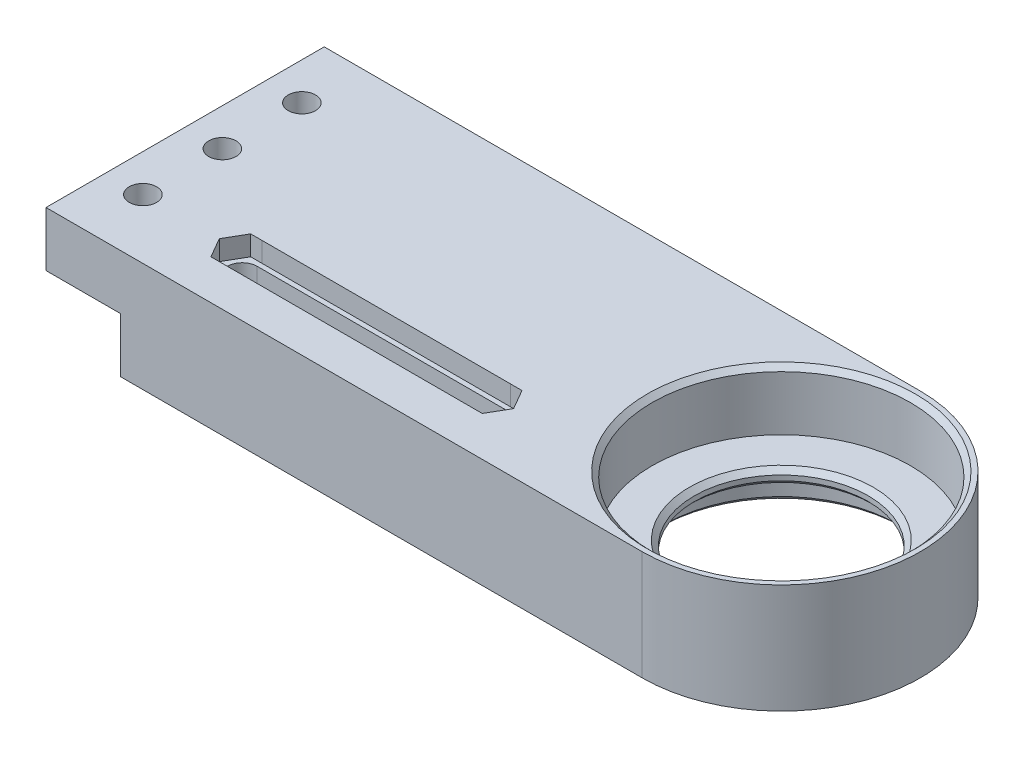
ISO-10303-21;
HEADER;
FILE_DESCRIPTION(('STEP AP214'),'2;1');
FILE_NAME('part.step','',(''),(''),'','','');
FILE_SCHEMA(('AUTOMOTIVE_DESIGN { 1 0 10303 214 1 1 1 1 }'));
ENDSEC;
DATA;
#1=APPLICATION_CONTEXT('core data for automotive mechanical design processes');
#2=APPLICATION_PROTOCOL_DEFINITION('international standard','automotive_design',2000,#1);
#3=PRODUCT_CONTEXT('',#1,'mechanical');
#4=PRODUCT('Part','Part','',(#3));
#5=PRODUCT_RELATED_PRODUCT_CATEGORY('part','',(#4));
#6=PRODUCT_DEFINITION_FORMATION('','',#4);
#7=PRODUCT_DEFINITION_CONTEXT('part definition',#1,'design');
#8=PRODUCT_DEFINITION('design','',#6,#7);
#9=PRODUCT_DEFINITION_SHAPE('','',#8);
#10=(LENGTH_UNIT() NAMED_UNIT(*) SI_UNIT(.MILLI.,.METRE.));
#11=(NAMED_UNIT(*) PLANE_ANGLE_UNIT() SI_UNIT($,.RADIAN.));
#12=(NAMED_UNIT(*) SI_UNIT($,.STERADIAN.) SOLID_ANGLE_UNIT());
#13=UNCERTAINTY_MEASURE_WITH_UNIT(LENGTH_MEASURE(1.E-05),#10,'distance_accuracy_value','');
#14=(GEOMETRIC_REPRESENTATION_CONTEXT(3) GLOBAL_UNCERTAINTY_ASSIGNED_CONTEXT((#13)) GLOBAL_UNIT_ASSIGNED_CONTEXT((#10,
#11,#12)) REPRESENTATION_CONTEXT('',''));
#15=CARTESIAN_POINT('',(0.,0.,0.));
#16=DIRECTION('',(0.,0.,1.));
#17=DIRECTION('',(1.,0.,0.));
#18=AXIS2_PLACEMENT_3D('',#15,#16,#17);
#19=CARTESIAN_POINT('',(0.,22.,0.));
#20=DIRECTION('',(0.,-1.,0.));
#21=DIRECTION('',(0.,0.,-1.));
#22=AXIS2_PLACEMENT_3D('',#19,#20,#21);
#23=PLANE('',#22);
#24=CARTESIAN_POINT('',(-112.5,22.,16.));
#25=DIRECTION('',(0.,1.,0.));
#26=DIRECTION('',(0.,0.,-1.));
#27=AXIS2_PLACEMENT_3D('',#24,#25,#26);
#28=CIRCLE('',#27,2.75000000000001);
#29=CARTESIAN_POINT('',(-112.5,22.,13.25));
#30=VERTEX_POINT('',#29);
#31=EDGE_CURVE('E283',#30,#30,#28,.T.);
#32=ORIENTED_EDGE('',*,*,#31,.F.);
#33=EDGE_LOOP('',(#32));
#34=FACE_BOUND('',#33,.T.);
#35=CARTESIAN_POINT('',(-112.5,22.,-16.));
#36=DIRECTION('',(0.,1.,0.));
#37=DIRECTION('',(0.,0.,1.));
#38=AXIS2_PLACEMENT_3D('',#35,#36,#37);
#39=CIRCLE('',#38,2.75000000000001);
#40=CARTESIAN_POINT('',(-112.5,22.,-13.25));
#41=VERTEX_POINT('',#40);
#42=EDGE_CURVE('E284',#41,#41,#39,.T.);
#43=ORIENTED_EDGE('',*,*,#42,.F.);
#44=EDGE_LOOP('',(#43));
#45=FACE_BOUND('',#44,.T.);
#46=CARTESIAN_POINT('',(-112.5,22.,0.));
#47=DIRECTION('',(0.,1.,0.));
#48=DIRECTION('',(0.,0.,1.));
#49=AXIS2_PLACEMENT_3D('',#46,#47,#48);
#50=CIRCLE('',#49,2.75000000000001);
#51=CARTESIAN_POINT('',(-112.5,22.,2.75000000000001));
#52=VERTEX_POINT('',#51);
#53=EDGE_CURVE('E291',#52,#52,#50,.T.);
#54=ORIENTED_EDGE('',*,*,#53,.F.);
#55=EDGE_LOOP('',(#54));
#56=FACE_BOUND('',#55,.T.);
#57=CARTESIAN_POINT('',(0.,22.,0.));
#58=DIRECTION('',(0.,-1.,0.));
#59=DIRECTION('',(0.,0.,-1.));
#60=AXIS2_PLACEMENT_3D('',#57,#58,#59);
#61=CIRCLE('',#60,27.);
#62=CARTESIAN_POINT('',(0.,22.,-27.));
#63=VERTEX_POINT('',#62);
#64=EDGE_CURVE('E368',#63,#63,#61,.T.);
#65=ORIENTED_EDGE('',*,*,#64,.T.);
#66=EDGE_LOOP('',(#65));
#67=FACE_BOUND('',#66,.T.);
#68=CARTESIAN_POINT('',(0.,22.,0.));
#69=DIRECTION('',(0.,1.,0.));
#70=DIRECTION('',(0.,0.,-1.));
#71=AXIS2_PLACEMENT_3D('',#68,#69,#70);
#72=CIRCLE('',#71,28.);
#73=CARTESIAN_POINT('',(0.,22.,28.));
#74=VERTEX_POINT('',#73);
#75=CARTESIAN_POINT('',(0.,22.,-28.));
#76=VERTEX_POINT('',#75);
#77=EDGE_CURVE('E325',#74,#76,#72,.T.);
#78=ORIENTED_EDGE('',*,*,#77,.T.);
#79=DIRECTION('',(-1.,0.,0.));
#80=VECTOR('',#79,1.);
#81=CARTESIAN_POINT('',(0.,22.,-28.));
#82=LINE('',#81,#80);
#83=CARTESIAN_POINT('',(-120.,22.,-27.9999999999999));
#84=VERTEX_POINT('',#83);
#85=EDGE_CURVE('E328',#76,#84,#82,.T.);
#86=ORIENTED_EDGE('',*,*,#85,.T.);
#87=DIRECTION('',(0.,0.,1.));
#88=VECTOR('',#87,1.);
#89=CARTESIAN_POINT('',(-120.,22.,-27.9999999999999));
#90=LINE('',#89,#88);
#91=CARTESIAN_POINT('',(-120.,22.,28.0000000000001));
#92=VERTEX_POINT('',#91);
#93=EDGE_CURVE('E331',#84,#92,#90,.T.);
#94=ORIENTED_EDGE('',*,*,#93,.T.);
#95=DIRECTION('',(1.,0.,0.));
#96=VECTOR('',#95,1.);
#97=CARTESIAN_POINT('',(0.,22.,28.));
#98=LINE('',#97,#96);
#99=EDGE_CURVE('E333',#92,#74,#98,.T.);
#100=ORIENTED_EDGE('',*,*,#99,.T.);
#101=EDGE_LOOP('',(#78,#86,#94,#100));
#102=FACE_BOUND('',#101,.T.);
#103=DIRECTION('',(-0.499999999999999,0.,0.86602540378444));
#104=VECTOR('',#103,1.);
#105=CARTESIAN_POINT('',(-21.4842503032257,22.,-12.4039376959046));
#106=LINE('',#105,#104);
#107=CARTESIAN_POINT('',(-37.8832713780015,22.,16.));
#108=VERTEX_POINT('',#107);
#109=CARTESIAN_POINT('',(-40.1916363874713,22.,19.998205478816));
#110=VERTEX_POINT('',#109);
#111=EDGE_CURVE('E48',#108,#110,#106,.T.);
#112=ORIENTED_EDGE('',*,*,#111,.T.);
#113=DIRECTION('',(-0.999999697824989,0.,0.000777399466875769));
#114=VECTOR('',#113,1.);
#115=CARTESIAN_POINT('',(0.0155222997672298,22.,19.9669484456429));
#116=LINE('',#115,#114);
#117=CARTESIAN_POINT('',(-42.5,22.,20.));
#118=VERTEX_POINT('',#117);
#119=EDGE_CURVE('E191',#110,#118,#116,.T.);
#120=ORIENTED_EDGE('',*,*,#119,.T.);
#121=DIRECTION('',(1.,0.,0.));
#122=VECTOR('',#121,1.);
#123=CARTESIAN_POINT('',(0.,22.,20.));
#124=LINE('',#123,#122);
#125=CARTESIAN_POINT('',(-92.5,22.,20.));
#126=VERTEX_POINT('',#125);
#127=EDGE_CURVE('E194',#126,#118,#124,.T.);
#128=ORIENTED_EDGE('',*,*,#127,.F.);
#129=DIRECTION('',(0.999999697824989,0.,0.000777399466875764));
#130=VECTOR('',#129,1.);
#131=CARTESIAN_POINT('',(-0.0156038870079281,22.,20.0718973419581));
#132=LINE('',#131,#130);
#133=CARTESIAN_POINT('',(-94.8083636125287,22.,19.998205478816));
#134=VERTEX_POINT('',#133);
#135=EDGE_CURVE('E239',#134,#126,#132,.T.);
#136=ORIENTED_EDGE('',*,*,#135,.F.);
#137=DIRECTION('',(0.499999999999999,0.,0.86602540378444));
#138=VECTOR('',#137,1.);
#139=CARTESIAN_POINT('',(-79.7657496967746,22.,46.0527770595449));
#140=LINE('',#139,#138);
#141=CARTESIAN_POINT('',(-97.1167286219986,22.,16.));
#142=VERTEX_POINT('',#141);
#143=EDGE_CURVE('E236',#142,#134,#140,.T.);
#144=ORIENTED_EDGE('',*,*,#143,.F.);
#145=DIRECTION('',(-0.500000000000002,0.,0.866025403784438));
#146=VECTOR('',#145,1.);
#147=CARTESIAN_POINT('',(-65.9093432362233,22.,-38.0527770595451));
#148=LINE('',#147,#146);
#149=CARTESIAN_POINT('',(-94.8083650094699,22.,12.0017969407571));
#150=VERTEX_POINT('',#149);
#151=EDGE_CURVE('E233',#150,#142,#148,.T.);
#152=ORIENTED_EDGE('',*,*,#151,.F.);
#153=DIRECTION('',(0.999999697009955,0.,-0.000778447171596968));
#154=VECTOR('',#153,1.);
#155=CARTESIAN_POINT('',(0.00928531007891821,22.,11.9279863866845));
#156=LINE('',#155,#154);
#157=CARTESIAN_POINT('',(-92.5,22.,12.));
#158=VERTEX_POINT('',#157);
#159=EDGE_CURVE('E230',#150,#158,#156,.T.);
#160=ORIENTED_EDGE('',*,*,#159,.T.);
#161=DIRECTION('',(1.,0.,0.));
#162=VECTOR('',#161,1.);
#163=CARTESIAN_POINT('',(0.,22.,12.));
#164=LINE('',#163,#162);
#165=CARTESIAN_POINT('',(-42.5,22.,12.));
#166=VERTEX_POINT('',#165);
#167=EDGE_CURVE('E227',#158,#166,#164,.T.);
#168=ORIENTED_EDGE('',*,*,#167,.T.);
#169=DIRECTION('',(-0.999999697009955,0.,-0.000778447171596973));
#170=VECTOR('',#169,1.);
#171=CARTESIAN_POINT('',(-0.00936711737877886,22.,12.0330767230088));
#172=LINE('',#171,#170);
#173=CARTESIAN_POINT('',(-40.1916349905302,22.,12.0017969407571));
#174=VERTEX_POINT('',#173);
#175=EDGE_CURVE('E224',#174,#166,#172,.T.);
#176=ORIENTED_EDGE('',*,*,#175,.F.);
#177=DIRECTION('',(0.500000000000002,0.,0.866025403784438));
#178=VECTOR('',#177,1.);
#179=CARTESIAN_POINT('',(-35.3406567637766,22.,20.4039376959047));
#180=LINE('',#179,#178);
#181=EDGE_CURVE('E222',#174,#108,#180,.T.);
#182=ORIENTED_EDGE('',*,*,#181,.T.);
#183=EDGE_LOOP('',(#112,#120,#128,#136,#144,#152,#160,#168,#176,#182));
#184=FACE_BOUND('',#183,.T.);
#185=ADVANCED_FACE('F33',(#34,#45,#56,#67,#102,#184),#23,.F.);
#186=CARTESIAN_POINT('',(-42.5,-0.001000000000001,16.));
#187=DIRECTION('',(0.,1.,0.));
#188=DIRECTION('',(0.,0.,1.));
#189=AXIS2_PLACEMENT_3D('',#186,#187,#188);
#190=CYLINDRICAL_SURFACE('',#189,3.);
#191=DIRECTION('',(0.,1.,0.));
#192=VECTOR('',#191,1.);
#193=CARTESIAN_POINT('',(-42.5,-0.001000000000001,19.));
#194=LINE('',#193,#192);
#195=CARTESIAN_POINT('',(-42.5,0.,19.));
#196=VERTEX_POINT('',#195);
#197=CARTESIAN_POINT('',(-42.5,18.,19.));
#198=VERTEX_POINT('',#197);
#199=EDGE_CURVE('E269',#196,#198,#194,.T.);
#200=ORIENTED_EDGE('',*,*,#199,.T.);
#201=CARTESIAN_POINT('',(-42.5,18.,16.));
#202=DIRECTION('',(0.,1.,0.));
#203=DIRECTION('',(0.,0.,1.));
#204=AXIS2_PLACEMENT_3D('',#201,#202,#203);
#205=CIRCLE('',#204,3.);
#206=CARTESIAN_POINT('',(-42.5,18.,13.));
#207=VERTEX_POINT('',#206);
#208=EDGE_CURVE('E216',#207,#198,#205,.F.);
#209=ORIENTED_EDGE('',*,*,#208,.F.);
#210=DIRECTION('',(0.,1.,0.));
#211=VECTOR('',#210,1.);
#212=CARTESIAN_POINT('',(-42.5,-0.001000000000001,13.));
#213=LINE('',#212,#211);
#214=CARTESIAN_POINT('',(-42.5,0.,13.));
#215=VERTEX_POINT('',#214);
#216=EDGE_CURVE('E268',#215,#207,#213,.T.);
#217=ORIENTED_EDGE('',*,*,#216,.F.);
#218=CARTESIAN_POINT('',(-42.5,0.,16.));
#219=DIRECTION('',(0.,-1.,0.));
#220=DIRECTION('',(0.,0.,-1.));
#221=AXIS2_PLACEMENT_3D('',#218,#219,#220);
#222=CIRCLE('',#221,3.);
#223=EDGE_CURVE('E266',#215,#196,#222,.T.);
#224=ORIENTED_EDGE('',*,*,#223,.T.);
#225=EDGE_LOOP('',(#200,#209,#217,#224));
#226=FACE_BOUND('',#225,.T.);
#227=ADVANCED_FACE('F391',(#226),#190,.F.);
#228=CARTESIAN_POINT('',(0.,-0.001000000000001,19.));
#229=DIRECTION('',(0.,0.,-1.));
#230=DIRECTION('',(-1.,0.,0.));
#231=AXIS2_PLACEMENT_3D('',#228,#229,#230);
#232=PLANE('',#231);
#233=DIRECTION('',(0.,1.,0.));
#234=VECTOR('',#233,1.);
#235=CARTESIAN_POINT('',(-92.5,-0.001000000000001,19.));
#236=LINE('',#235,#234);
#237=CARTESIAN_POINT('',(-92.5,0.,19.));
#238=VERTEX_POINT('',#237);
#239=CARTESIAN_POINT('',(-92.5,18.,19.));
#240=VERTEX_POINT('',#239);
#241=EDGE_CURVE('E273',#238,#240,#236,.T.);
#242=ORIENTED_EDGE('',*,*,#241,.T.);
#243=DIRECTION('',(-1.,0.,0.));
#244=VECTOR('',#243,1.);
#245=CARTESIAN_POINT('',(0.,18.,19.));
#246=LINE('',#245,#244);
#247=EDGE_CURVE('E218',#198,#240,#246,.T.);
#248=ORIENTED_EDGE('',*,*,#247,.F.);
#249=ORIENTED_EDGE('',*,*,#199,.F.);
#250=DIRECTION('',(-1.,0.,0.));
#251=VECTOR('',#250,1.);
#252=CARTESIAN_POINT('',(0.,0.,19.));
#253=LINE('',#252,#251);
#254=EDGE_CURVE('E264',#196,#238,#253,.T.);
#255=ORIENTED_EDGE('',*,*,#254,.T.);
#256=EDGE_LOOP('',(#242,#248,#249,#255));
#257=FACE_BOUND('',#256,.T.);
#258=ADVANCED_FACE('F397',(#257),#232,.T.);
#259=CARTESIAN_POINT('',(-92.5,-0.001000000000001,16.));
#260=DIRECTION('',(0.,1.,0.));
#261=DIRECTION('',(0.,0.,1.));
#262=AXIS2_PLACEMENT_3D('',#259,#260,#261);
#263=CYLINDRICAL_SURFACE('',#262,3.);
#264=CARTESIAN_POINT('',(-92.5,18.,16.));
#265=DIRECTION('',(0.,1.,0.));
#266=DIRECTION('',(0.,0.,1.));
#267=AXIS2_PLACEMENT_3D('',#264,#265,#266);
#268=CIRCLE('',#267,3.);
#269=CARTESIAN_POINT('',(-92.5,18.,13.));
#270=VERTEX_POINT('',#269);
#271=EDGE_CURVE('E56',#270,#240,#268,.T.);
#272=ORIENTED_EDGE('',*,*,#271,.T.);
#273=ORIENTED_EDGE('',*,*,#241,.F.);
#274=CARTESIAN_POINT('',(-92.5,0.,16.));
#275=DIRECTION('',(0.,-1.,0.));
#276=DIRECTION('',(0.,0.,-1.));
#277=AXIS2_PLACEMENT_3D('',#274,#275,#276);
#278=CIRCLE('',#277,3.);
#279=CARTESIAN_POINT('',(-92.5,0.,13.));
#280=VERTEX_POINT('',#279);
#281=EDGE_CURVE('E246',#280,#238,#278,.F.);
#282=ORIENTED_EDGE('',*,*,#281,.F.);
#283=DIRECTION('',(0.,1.,0.));
#284=VECTOR('',#283,1.);
#285=CARTESIAN_POINT('',(-92.5,-0.001000000000001,13.));
#286=LINE('',#285,#284);
#287=EDGE_CURVE('E276',#280,#270,#286,.T.);
#288=ORIENTED_EDGE('',*,*,#287,.T.);
#289=EDGE_LOOP('',(#272,#273,#282,#288));
#290=FACE_BOUND('',#289,.T.);
#291=ADVANCED_FACE('F546',(#290),#263,.F.);
#292=CARTESIAN_POINT('',(0.,-0.001000000000001,13.));
#293=DIRECTION('',(0.,0.,-1.));
#294=DIRECTION('',(-1.,0.,0.));
#295=AXIS2_PLACEMENT_3D('',#292,#293,#294);
#296=PLANE('',#295);
#297=DIRECTION('',(-1.,0.,0.));
#298=VECTOR('',#297,1.);
#299=CARTESIAN_POINT('',(0.,18.,13.));
#300=LINE('',#299,#298);
#301=EDGE_CURVE('E214',#207,#270,#300,.T.);
#302=ORIENTED_EDGE('',*,*,#301,.T.);
#303=ORIENTED_EDGE('',*,*,#287,.F.);
#304=DIRECTION('',(-1.,0.,0.));
#305=VECTOR('',#304,1.);
#306=CARTESIAN_POINT('',(0.,0.,13.));
#307=LINE('',#306,#305);
#308=EDGE_CURVE('E272',#215,#280,#307,.T.);
#309=ORIENTED_EDGE('',*,*,#308,.F.);
#310=ORIENTED_EDGE('',*,*,#216,.T.);
#311=EDGE_LOOP('',(#302,#303,#309,#310));
#312=FACE_BOUND('',#311,.T.);
#313=ADVANCED_FACE('F410',(#312),#296,.F.);
#314=CARTESIAN_POINT('',(0.,0.,0.));
#315=DIRECTION('',(0.,-1.,0.));
#316=DIRECTION('',(0.,0.,-1.));
#317=AXIS2_PLACEMENT_3D('',#314,#315,#316);
#318=PLANE('',#317);
#319=CARTESIAN_POINT('',(0.,0.,0.));
#320=DIRECTION('',(0.,-1.,0.));
#321=DIRECTION('',(0.,0.,-1.));
#322=AXIS2_PLACEMENT_3D('',#319,#320,#321);
#323=CIRCLE('',#322,24.5);
#324=CARTESIAN_POINT('',(0.,0.,-24.5));
#325=VERTEX_POINT('',#324);
#326=EDGE_CURVE('E11',#325,#325,#323,.F.);
#327=ORIENTED_EDGE('',*,*,#326,.T.);
#328=EDGE_LOOP('',(#327));
#329=FACE_BOUND('',#328,.T.);
#330=DIRECTION('',(0.,0.,1.));
#331=VECTOR('',#330,1.);
#332=CARTESIAN_POINT('',(-105.,0.,-28.001));
#333=LINE('',#332,#331);
#334=CARTESIAN_POINT('',(-105.,0.,-27.9999999999999));
#335=VERTEX_POINT('',#334);
#336=CARTESIAN_POINT('',(-105.,0.,28.));
#337=VERTEX_POINT('',#336);
#338=EDGE_CURVE('E317',#335,#337,#333,.T.);
#339=ORIENTED_EDGE('',*,*,#338,.F.);
#340=DIRECTION('',(-1.,0.,0.));
#341=VECTOR('',#340,1.);
#342=CARTESIAN_POINT('',(0.,0.,-28.));
#343=LINE('',#342,#341);
#344=CARTESIAN_POINT('',(0.,0.,-28.));
#345=VERTEX_POINT('',#344);
#346=EDGE_CURVE('E338',#345,#335,#343,.T.);
#347=ORIENTED_EDGE('',*,*,#346,.F.);
#348=CARTESIAN_POINT('',(0.,0.,0.));
#349=DIRECTION('',(0.,1.,0.));
#350=DIRECTION('',(0.,0.,-1.));
#351=AXIS2_PLACEMENT_3D('',#348,#349,#350);
#352=CIRCLE('',#351,28.);
#353=CARTESIAN_POINT('',(0.,0.,28.));
#354=VERTEX_POINT('',#353);
#355=EDGE_CURVE('E321',#354,#345,#352,.T.);
#356=ORIENTED_EDGE('',*,*,#355,.F.);
#357=DIRECTION('',(1.,0.,0.));
#358=VECTOR('',#357,1.);
#359=CARTESIAN_POINT('',(0.,0.,28.));
#360=LINE('',#359,#358);
#361=EDGE_CURVE('E329',#337,#354,#360,.T.);
#362=ORIENTED_EDGE('',*,*,#361,.F.);
#363=EDGE_LOOP('',(#339,#347,#356,#362));
#364=FACE_BOUND('',#363,.T.);
#365=ORIENTED_EDGE('',*,*,#254,.F.);
#366=ORIENTED_EDGE('',*,*,#223,.F.);
#367=ORIENTED_EDGE('',*,*,#308,.T.);
#368=ORIENTED_EDGE('',*,*,#281,.T.);
#369=EDGE_LOOP('',(#365,#366,#367,#368));
#370=FACE_BOUND('',#369,.T.);
#371=ADVANCED_FACE('F406',(#329,#364,#370),#318,.T.);
#372=CARTESIAN_POINT('',(0.,-0.000999999999999265,0.));
#373=DIRECTION('',(0.,1.,0.));
#374=DIRECTION('',(0.,0.,1.));
#375=AXIS2_PLACEMENT_3D('',#372,#373,#374);
#376=CYLINDRICAL_SURFACE('',#375,17.5);
#377=CARTESIAN_POINT('',(0.,7.99999999999995,0.));
#378=DIRECTION('',(0.,-1.,0.));
#379=DIRECTION('',(0.,0.,-1.));
#380=AXIS2_PLACEMENT_3D('',#377,#378,#379);
#381=CIRCLE('',#380,17.5);
#382=CARTESIAN_POINT('',(0.,7.99999999999995,-17.5));
#383=VERTEX_POINT('',#382);
#384=EDGE_CURVE('E359',#383,#383,#381,.T.);
#385=ORIENTED_EDGE('',*,*,#384,.T.);
#386=EDGE_LOOP('',(#385));
#387=FACE_BOUND('',#386,.T.);
#388=CARTESIAN_POINT('',(0.,9.00000000000002,0.));
#389=DIRECTION('',(0.,1.,0.));
#390=DIRECTION('',(0.,0.,1.));
#391=AXIS2_PLACEMENT_3D('',#388,#389,#390);
#392=CIRCLE('',#391,17.5);
#393=CARTESIAN_POINT('',(0.,9.00000000000002,17.5));
#394=VERTEX_POINT('',#393);
#395=EDGE_CURVE('E356',#394,#394,#392,.T.);
#396=ORIENTED_EDGE('',*,*,#395,.T.);
#397=EDGE_LOOP('',(#396));
#398=FACE_BOUND('',#397,.T.);
#399=ADVANCED_FACE('F409',(#387,#398),#376,.F.);
#400=CARTESIAN_POINT('',(0.,22.,0.));
#401=DIRECTION('',(0.,-1.,0.));
#402=DIRECTION('',(0.,0.,-1.));
#403=AXIS2_PLACEMENT_3D('',#400,#401,#402);
#404=CYLINDRICAL_SURFACE('',#403,28.);
#405=ORIENTED_EDGE('',*,*,#355,.T.);
#406=DIRECTION('',(0.,-1.,0.));
#407=VECTOR('',#406,1.);
#408=CARTESIAN_POINT('',(0.,22.,-28.));
#409=LINE('',#408,#407);
#410=EDGE_CURVE('E350',#76,#345,#409,.T.);
#411=ORIENTED_EDGE('',*,*,#410,.F.);
#412=ORIENTED_EDGE('',*,*,#77,.F.);
#413=DIRECTION('',(0.,-1.,0.));
#414=VECTOR('',#413,1.);
#415=CARTESIAN_POINT('',(0.,22.,28.));
#416=LINE('',#415,#414);
#417=EDGE_CURVE('E335',#74,#354,#416,.T.);
#418=ORIENTED_EDGE('',*,*,#417,.T.);
#419=EDGE_LOOP('',(#405,#411,#412,#418));
#420=FACE_BOUND('',#419,.T.);
#421=ADVANCED_FACE('F424',(#420),#404,.T.);
#422=CARTESIAN_POINT('',(0.,22.,-28.));
#423=DIRECTION('',(0.,0.,1.));
#424=DIRECTION('',(1.,0.,0.));
#425=AXIS2_PLACEMENT_3D('',#422,#423,#424);
#426=PLANE('',#425);
#427=DIRECTION('',(0.,-1.,0.));
#428=VECTOR('',#427,1.);
#429=CARTESIAN_POINT('',(-105.,0.,-27.9999999999999));
#430=LINE('',#429,#428);
#431=CARTESIAN_POINT('',(-105.,11.,-27.9999999999999));
#432=VERTEX_POINT('',#431);
#433=EDGE_CURVE('E307',#432,#335,#430,.T.);
#434=ORIENTED_EDGE('',*,*,#433,.F.);
#435=DIRECTION('',(1.,0.,0.));
#436=VECTOR('',#435,1.);
#437=CARTESIAN_POINT('',(-120.,11.,-27.9999999999999));
#438=LINE('',#437,#436);
#439=CARTESIAN_POINT('',(-120.,11.,-27.9999999999999));
#440=VERTEX_POINT('',#439);
#441=EDGE_CURVE('E309',#440,#432,#438,.T.);
#442=ORIENTED_EDGE('',*,*,#441,.F.);
#443=DIRECTION('',(0.,-1.,0.));
#444=VECTOR('',#443,1.);
#445=CARTESIAN_POINT('',(-120.,22.,-27.9999999999999));
#446=LINE('',#445,#444);
#447=EDGE_CURVE('E347',#84,#440,#446,.T.);
#448=ORIENTED_EDGE('',*,*,#447,.F.);
#449=ORIENTED_EDGE('',*,*,#85,.F.);
#450=ORIENTED_EDGE('',*,*,#410,.T.);
#451=ORIENTED_EDGE('',*,*,#346,.T.);
#452=EDGE_LOOP('',(#434,#442,#448,#449,#450,#451));
#453=FACE_BOUND('',#452,.T.);
#454=ADVANCED_FACE('F420',(#453),#426,.F.);
#455=CARTESIAN_POINT('',(-120.,22.,-27.9999999999999));
#456=DIRECTION('',(1.,0.,0.));
#457=DIRECTION('',(0.,0.,-1.));
#458=AXIS2_PLACEMENT_3D('',#455,#456,#457);
#459=PLANE('',#458);
#460=ORIENTED_EDGE('',*,*,#447,.T.);
#461=DIRECTION('',(0.,0.,1.));
#462=VECTOR('',#461,1.);
#463=CARTESIAN_POINT('',(-120.,11.,-28.001));
#464=LINE('',#463,#462);
#465=CARTESIAN_POINT('',(-120.,11.,28.));
#466=VERTEX_POINT('',#465);
#467=EDGE_CURVE('E318',#440,#466,#464,.T.);
#468=ORIENTED_EDGE('',*,*,#467,.T.);
#469=DIRECTION('',(0.,-1.,0.));
#470=VECTOR('',#469,1.);
#471=CARTESIAN_POINT('',(-120.,22.,28.0000000000001));
#472=LINE('',#471,#470);
#473=EDGE_CURVE('E344',#92,#466,#472,.T.);
#474=ORIENTED_EDGE('',*,*,#473,.F.);
#475=ORIENTED_EDGE('',*,*,#93,.F.);
#476=EDGE_LOOP('',(#460,#468,#474,#475));
#477=FACE_BOUND('',#476,.T.);
#478=ADVANCED_FACE('F416',(#477),#459,.F.);
#479=CARTESIAN_POINT('',(0.,22.,28.));
#480=DIRECTION('',(0.,0.,-1.));
#481=DIRECTION('',(-1.,0.,0.));
#482=AXIS2_PLACEMENT_3D('',#479,#480,#481);
#483=PLANE('',#482);
#484=ORIENTED_EDGE('',*,*,#473,.T.);
#485=DIRECTION('',(-1.,0.,0.));
#486=VECTOR('',#485,1.);
#487=CARTESIAN_POINT('',(-120.,11.,28.));
#488=LINE('',#487,#486);
#489=CARTESIAN_POINT('',(-105.,11.,28.));
#490=VERTEX_POINT('',#489);
#491=EDGE_CURVE('E315',#490,#466,#488,.T.);
#492=ORIENTED_EDGE('',*,*,#491,.F.);
#493=DIRECTION('',(0.,1.,0.));
#494=VECTOR('',#493,1.);
#495=CARTESIAN_POINT('',(-105.,0.,28.));
#496=LINE('',#495,#494);
#497=EDGE_CURVE('E312',#337,#490,#496,.T.);
#498=ORIENTED_EDGE('',*,*,#497,.F.);
#499=ORIENTED_EDGE('',*,*,#361,.T.);
#500=ORIENTED_EDGE('',*,*,#417,.F.);
#501=ORIENTED_EDGE('',*,*,#99,.F.);
#502=EDGE_LOOP('',(#484,#492,#498,#499,#500,#501));
#503=FACE_BOUND('',#502,.T.);
#504=ADVANCED_FACE('F412',(#503),#483,.F.);
#505=CARTESIAN_POINT('',(-120.,11.,-28.001));
#506=DIRECTION('',(0.,1.,0.));
#507=DIRECTION('',(0.,0.,1.));
#508=AXIS2_PLACEMENT_3D('',#505,#506,#507);
#509=PLANE('',#508);
#510=CARTESIAN_POINT('',(-112.5,11.,16.));
#511=DIRECTION('',(0.,1.,0.));
#512=DIRECTION('',(0.,0.,1.));
#513=AXIS2_PLACEMENT_3D('',#510,#511,#512);
#514=CIRCLE('',#513,2.75000000000001);
#515=CARTESIAN_POINT('',(-112.5,11.,18.75));
#516=VERTEX_POINT('',#515);
#517=EDGE_CURVE('E288',#516,#516,#514,.F.);
#518=ORIENTED_EDGE('',*,*,#517,.F.);
#519=EDGE_LOOP('',(#518));
#520=FACE_BOUND('',#519,.T.);
#521=CARTESIAN_POINT('',(-112.5,11.,-16.));
#522=DIRECTION('',(0.,1.,0.));
#523=DIRECTION('',(0.,0.,1.));
#524=AXIS2_PLACEMENT_3D('',#521,#522,#523);
#525=CIRCLE('',#524,2.75000000000001);
#526=CARTESIAN_POINT('',(-112.5,11.,-13.25));
#527=VERTEX_POINT('',#526);
#528=EDGE_CURVE('E287',#527,#527,#525,.F.);
#529=ORIENTED_EDGE('',*,*,#528,.F.);
#530=EDGE_LOOP('',(#529));
#531=FACE_BOUND('',#530,.T.);
#532=CARTESIAN_POINT('',(-112.5,11.,0.));
#533=DIRECTION('',(0.,1.,0.));
#534=DIRECTION('',(0.,0.,1.));
#535=AXIS2_PLACEMENT_3D('',#532,#533,#534);
#536=CIRCLE('',#535,2.75000000000001);
#537=CARTESIAN_POINT('',(-112.5,11.,2.75000000000001));
#538=VERTEX_POINT('',#537);
#539=EDGE_CURVE('E298',#538,#538,#536,.F.);
#540=ORIENTED_EDGE('',*,*,#539,.F.);
#541=EDGE_LOOP('',(#540));
#542=FACE_BOUND('',#541,.T.);
#543=ORIENTED_EDGE('',*,*,#441,.T.);
#544=DIRECTION('',(0.,0.,1.));
#545=VECTOR('',#544,1.);
#546=CARTESIAN_POINT('',(-105.,11.,-28.001));
#547=LINE('',#546,#545);
#548=EDGE_CURVE('E322',#432,#490,#547,.T.);
#549=ORIENTED_EDGE('',*,*,#548,.T.);
#550=ORIENTED_EDGE('',*,*,#491,.T.);
#551=ORIENTED_EDGE('',*,*,#467,.F.);
#552=EDGE_LOOP('',(#543,#549,#550,#551));
#553=FACE_BOUND('',#552,.T.);
#554=ADVANCED_FACE('F415',(#520,#531,#542,#553),#509,.F.);
#555=CARTESIAN_POINT('',(-105.,0.,-28.001));
#556=DIRECTION('',(1.,0.,0.));
#557=DIRECTION('',(0.,0.,-1.));
#558=AXIS2_PLACEMENT_3D('',#555,#556,#557);
#559=PLANE('',#558);
#560=ORIENTED_EDGE('',*,*,#433,.T.);
#561=ORIENTED_EDGE('',*,*,#338,.T.);
#562=ORIENTED_EDGE('',*,*,#497,.T.);
#563=ORIENTED_EDGE('',*,*,#548,.F.);
#564=EDGE_LOOP('',(#560,#561,#562,#563));
#565=FACE_BOUND('',#564,.T.);
#566=ADVANCED_FACE('F404',(#565),#559,.F.);
#567=CARTESIAN_POINT('',(0.,10.,0.));
#568=DIRECTION('',(0.,1.,0.));
#569=DIRECTION('',(0.,0.,1.));
#570=AXIS2_PLACEMENT_3D('',#567,#568,#569);
#571=CYLINDRICAL_SURFACE('',#570,26.);
#572=CARTESIAN_POINT('',(0.,21.,0.));
#573=DIRECTION('',(0.,-1.,0.));
#574=DIRECTION('',(0.,0.,-1.));
#575=AXIS2_PLACEMENT_3D('',#572,#573,#574);
#576=CIRCLE('',#575,26.);
#577=CARTESIAN_POINT('',(0.,21.,-26.));
#578=VERTEX_POINT('',#577);
#579=EDGE_CURVE('E365',#578,#578,#576,.F.);
#580=ORIENTED_EDGE('',*,*,#579,.T.);
#581=EDGE_LOOP('',(#580));
#582=FACE_BOUND('',#581,.T.);
#583=CARTESIAN_POINT('',(0.,10.,0.));
#584=DIRECTION('',(0.,1.,0.));
#585=DIRECTION('',(0.,0.,1.));
#586=AXIS2_PLACEMENT_3D('',#583,#584,#585);
#587=CIRCLE('',#586,26.);
#588=CARTESIAN_POINT('',(0.,10.,26.));
#589=VERTEX_POINT('',#588);
#590=EDGE_CURVE('E304',#589,#589,#587,.T.);
#591=ORIENTED_EDGE('',*,*,#590,.F.);
#592=EDGE_LOOP('',(#591));
#593=FACE_BOUND('',#592,.T.);
#594=ADVANCED_FACE('F453',(#582,#593),#571,.F.);
#595=CARTESIAN_POINT('',(0.,10.,0.));
#596=DIRECTION('',(0.,1.,0.));
#597=DIRECTION('',(0.,0.,1.));
#598=AXIS2_PLACEMENT_3D('',#595,#596,#597);
#599=PLANE('',#598);
#600=CARTESIAN_POINT('',(0.,10.,0.));
#601=DIRECTION('',(0.,1.,0.));
#602=DIRECTION('',(0.,0.,1.));
#603=AXIS2_PLACEMENT_3D('',#600,#601,#602);
#604=CIRCLE('',#603,18.5);
#605=CARTESIAN_POINT('',(0.,10.,18.5));
#606=VERTEX_POINT('',#605);
#607=EDGE_CURVE('E362',#606,#606,#604,.F.);
#608=ORIENTED_EDGE('',*,*,#607,.T.);
#609=EDGE_LOOP('',(#608));
#610=FACE_BOUND('',#609,.T.);
#611=ORIENTED_EDGE('',*,*,#590,.T.);
#612=EDGE_LOOP('',(#611));
#613=FACE_BOUND('',#612,.T.);
#614=ADVANCED_FACE('F449',(#610,#613),#599,.T.);
#615=CARTESIAN_POINT('',(0.,7.,0.));
#616=DIRECTION('',(0.,-1.,0.));
#617=DIRECTION('',(0.,0.,-1.));
#618=AXIS2_PLACEMENT_3D('',#615,#616,#617);
#619=PLANE('',#618);
#620=CARTESIAN_POINT('',(0.,7.,0.));
#621=DIRECTION('',(0.,-1.,0.));
#622=DIRECTION('',(0.,0.,-1.));
#623=AXIS2_PLACEMENT_3D('',#620,#621,#622);
#624=CIRCLE('',#623,18.5);
#625=CARTESIAN_POINT('',(0.,7.,-18.5));
#626=VERTEX_POINT('',#625);
#627=EDGE_CURVE('E353',#626,#626,#624,.F.);
#628=ORIENTED_EDGE('',*,*,#627,.T.);
#629=EDGE_LOOP('',(#628));
#630=FACE_BOUND('',#629,.T.);
#631=CARTESIAN_POINT('',(0.,7.,0.));
#632=DIRECTION('',(0.,-1.,0.));
#633=DIRECTION('',(0.,0.,-1.));
#634=AXIS2_PLACEMENT_3D('',#631,#632,#633);
#635=CIRCLE('',#634,23.5);
#636=CARTESIAN_POINT('',(0.,7.,-23.5));
#637=VERTEX_POINT('',#636);
#638=EDGE_CURVE('E301',#637,#637,#635,.T.);
#639=ORIENTED_EDGE('',*,*,#638,.T.);
#640=EDGE_LOOP('',(#639));
#641=FACE_BOUND('',#640,.T.);
#642=ADVANCED_FACE('F452',(#630,#641),#619,.T.);
#643=CARTESIAN_POINT('',(0.,7.,0.));
#644=DIRECTION('',(0.,-1.,0.));
#645=DIRECTION('',(0.,0.,-1.));
#646=AXIS2_PLACEMENT_3D('',#643,#644,#645);
#647=CYLINDRICAL_SURFACE('',#646,23.5);
#648=CARTESIAN_POINT('',(0.,0.999999999999977,0.));
#649=DIRECTION('',(0.,-1.,0.));
#650=DIRECTION('',(0.,0.,-1.));
#651=AXIS2_PLACEMENT_3D('',#648,#649,#650);
#652=CIRCLE('',#651,23.5);
#653=CARTESIAN_POINT('',(0.,0.999999999999977,-23.5));
#654=VERTEX_POINT('',#653);
#655=EDGE_CURVE('E41',#654,#654,#652,.T.);
#656=ORIENTED_EDGE('',*,*,#655,.T.);
#657=EDGE_LOOP('',(#656));
#658=FACE_BOUND('',#657,.T.);
#659=ORIENTED_EDGE('',*,*,#638,.F.);
#660=EDGE_LOOP('',(#659));
#661=FACE_BOUND('',#660,.T.);
#662=ADVANCED_FACE('F373',(#658,#661),#647,.F.);
#663=CARTESIAN_POINT('',(0.,7.,0.));
#664=DIRECTION('',(0.,-1.,0.));
#665=DIRECTION('',(0.,0.,-1.));
#666=AXIS2_PLACEMENT_3D('',#663,#664,#665);
#667=CONICAL_SURFACE('',#666,18.5,0.78539816339745);
#668=ORIENTED_EDGE('',*,*,#384,.F.);
#669=EDGE_LOOP('',(#668));
#670=FACE_BOUND('',#669,.T.);
#671=ORIENTED_EDGE('',*,*,#627,.F.);
#672=EDGE_LOOP('',(#671));
#673=FACE_BOUND('',#672,.T.);
#674=ADVANCED_FACE('F429',(#670,#673),#667,.F.);
#675=CARTESIAN_POINT('',(0.,9.00000000000002,0.));
#676=DIRECTION('',(0.,1.,0.));
#677=DIRECTION('',(0.,0.,1.));
#678=AXIS2_PLACEMENT_3D('',#675,#676,#677);
#679=CONICAL_SURFACE('',#678,17.5,0.785398163397447);
#680=ORIENTED_EDGE('',*,*,#607,.F.);
#681=EDGE_LOOP('',(#680));
#682=FACE_BOUND('',#681,.T.);
#683=ORIENTED_EDGE('',*,*,#395,.F.);
#684=EDGE_LOOP('',(#683));
#685=FACE_BOUND('',#684,.T.);
#686=ADVANCED_FACE('F387',(#682,#685),#679,.F.);
#687=CARTESIAN_POINT('',(0.,21.,0.));
#688=DIRECTION('',(0.,1.,0.));
#689=DIRECTION('',(0.,0.,1.));
#690=AXIS2_PLACEMENT_3D('',#687,#688,#689);
#691=CONICAL_SURFACE('',#690,26.,0.78539816339746);
#692=ORIENTED_EDGE('',*,*,#64,.F.);
#693=EDGE_LOOP('',(#692));
#694=FACE_BOUND('',#693,.T.);
#695=ORIENTED_EDGE('',*,*,#579,.F.);
#696=EDGE_LOOP('',(#695));
#697=FACE_BOUND('',#696,.T.);
#698=ADVANCED_FACE('F378',(#694,#697),#691,.F.);
#699=CARTESIAN_POINT('',(0.,0.999999999999977,0.));
#700=DIRECTION('',(0.,-1.,0.));
#701=DIRECTION('',(0.,0.,-1.));
#702=AXIS2_PLACEMENT_3D('',#699,#700,#701);
#703=CONICAL_SURFACE('',#702,23.5,0.785398163397462);
#704=ORIENTED_EDGE('',*,*,#326,.F.);
#705=EDGE_LOOP('',(#704));
#706=FACE_BOUND('',#705,.T.);
#707=ORIENTED_EDGE('',*,*,#655,.F.);
#708=EDGE_LOOP('',(#707));
#709=FACE_BOUND('',#708,.T.);
#710=ADVANCED_FACE('F35',(#706,#709),#703,.F.);
#711=CARTESIAN_POINT('',(-112.5,-0.001000000000001,0.));
#712=DIRECTION('',(0.,1.,0.));
#713=DIRECTION('',(0.,0.,1.));
#714=AXIS2_PLACEMENT_3D('',#711,#712,#713);
#715=CYLINDRICAL_SURFACE('',#714,2.75000000000001);
#716=ORIENTED_EDGE('',*,*,#53,.T.);
#717=EDGE_LOOP('',(#716));
#718=FACE_BOUND('',#717,.T.);
#719=ORIENTED_EDGE('',*,*,#539,.T.);
#720=EDGE_LOOP('',(#719));
#721=FACE_BOUND('',#720,.T.);
#722=ADVANCED_FACE('F377',(#718,#721),#715,.F.);
#723=CARTESIAN_POINT('',(-112.5,-0.001000000000001,-16.));
#724=DIRECTION('',(0.,1.,0.));
#725=DIRECTION('',(0.,0.,1.));
#726=AXIS2_PLACEMENT_3D('',#723,#724,#725);
#727=CYLINDRICAL_SURFACE('',#726,2.75000000000001);
#728=ORIENTED_EDGE('',*,*,#42,.T.);
#729=EDGE_LOOP('',(#728));
#730=FACE_BOUND('',#729,.T.);
#731=ORIENTED_EDGE('',*,*,#528,.T.);
#732=EDGE_LOOP('',(#731));
#733=FACE_BOUND('',#732,.T.);
#734=ADVANCED_FACE('F384',(#730,#733),#727,.F.);
#735=CARTESIAN_POINT('',(-112.5,-0.001000000000001,16.));
#736=DIRECTION('',(0.,1.,0.));
#737=DIRECTION('',(0.,0.,1.));
#738=AXIS2_PLACEMENT_3D('',#735,#736,#737);
#739=CYLINDRICAL_SURFACE('',#738,2.75000000000001);
#740=ORIENTED_EDGE('',*,*,#31,.T.);
#741=EDGE_LOOP('',(#740));
#742=FACE_BOUND('',#741,.T.);
#743=ORIENTED_EDGE('',*,*,#517,.T.);
#744=EDGE_LOOP('',(#743));
#745=FACE_BOUND('',#744,.T.);
#746=ADVANCED_FACE('F526',(#742,#745),#739,.F.);
#747=CARTESIAN_POINT('',(-21.4842503032257,18.,-12.4039376959046));
#748=DIRECTION('',(-0.86602540378444,0.,-0.499999999999999));
#749=DIRECTION('',(-0.499999999999999,0.,0.86602540378444));
#750=AXIS2_PLACEMENT_3D('',#747,#748,#749);
#751=PLANE('',#750);
#752=ORIENTED_EDGE('',*,*,#111,.F.);
#753=DIRECTION('',(0.,1.,0.));
#754=VECTOR('',#753,1.);
#755=CARTESIAN_POINT('',(-37.8832713780015,18.,16.));
#756=LINE('',#755,#754);
#757=CARTESIAN_POINT('',(-37.8832713780015,18.,16.));
#758=VERTEX_POINT('',#757);
#759=EDGE_CURVE('E174',#758,#108,#756,.T.);
#760=ORIENTED_EDGE('',*,*,#759,.F.);
#761=DIRECTION('',(-0.499999999999999,0.,0.86602540378444));
#762=VECTOR('',#761,1.);
#763=CARTESIAN_POINT('',(-21.4842503032257,18.,-12.4039376959046));
#764=LINE('',#763,#762);
#765=CARTESIAN_POINT('',(-40.1916363874713,18.,19.998205478816));
#766=VERTEX_POINT('',#765);
#767=EDGE_CURVE('E182',#758,#766,#764,.T.);
#768=ORIENTED_EDGE('',*,*,#767,.T.);
#769=DIRECTION('',(0.,1.,0.));
#770=VECTOR('',#769,1.);
#771=CARTESIAN_POINT('',(-40.1916363874713,18.,19.998205478816));
#772=LINE('',#771,#770);
#773=EDGE_CURVE('E244',#766,#110,#772,.T.);
#774=ORIENTED_EDGE('',*,*,#773,.T.);
#775=EDGE_LOOP('',(#752,#760,#768,#774));
#776=FACE_BOUND('',#775,.T.);
#777=ADVANCED_FACE('F185',(#776),#751,.T.);
#778=CARTESIAN_POINT('',(0.0155222997672298,18.,19.9669484456429));
#779=DIRECTION('',(-0.000777399466875769,0.,-0.999999697824989));
#780=DIRECTION('',(-0.999999697824989,0.,0.000777399466875769));
#781=AXIS2_PLACEMENT_3D('',#778,#779,#780);
#782=PLANE('',#781);
#783=ORIENTED_EDGE('',*,*,#119,.F.);
#784=ORIENTED_EDGE('',*,*,#773,.F.);
#785=DIRECTION('',(-0.999999697824989,0.,0.000777399466875769));
#786=VECTOR('',#785,1.);
#787=CARTESIAN_POINT('',(0.0155222997672298,18.,19.9669484456429));
#788=LINE('',#787,#786);
#789=CARTESIAN_POINT('',(-42.5,18.,20.));
#790=VERTEX_POINT('',#789);
#791=EDGE_CURVE('E190',#766,#790,#788,.T.);
#792=ORIENTED_EDGE('',*,*,#791,.T.);
#793=DIRECTION('',(0.,1.,0.));
#794=VECTOR('',#793,1.);
#795=CARTESIAN_POINT('',(-42.5,18.,20.));
#796=LINE('',#795,#794);
#797=EDGE_CURVE('E247',#790,#118,#796,.T.);
#798=ORIENTED_EDGE('',*,*,#797,.T.);
#799=EDGE_LOOP('',(#783,#784,#792,#798));
#800=FACE_BOUND('',#799,.T.);
#801=ADVANCED_FACE('F518',(#800),#782,.T.);
#802=CARTESIAN_POINT('',(0.,18.,20.));
#803=DIRECTION('',(0.,0.,1.));
#804=DIRECTION('',(1.,0.,0.));
#805=AXIS2_PLACEMENT_3D('',#802,#803,#804);
#806=PLANE('',#805);
#807=ORIENTED_EDGE('',*,*,#127,.T.);
#808=ORIENTED_EDGE('',*,*,#797,.F.);
#809=DIRECTION('',(1.,0.,0.));
#810=VECTOR('',#809,1.);
#811=CARTESIAN_POINT('',(0.,18.,20.));
#812=LINE('',#811,#810);
#813=CARTESIAN_POINT('',(-92.5,18.,20.));
#814=VERTEX_POINT('',#813);
#815=EDGE_CURVE('E211',#814,#790,#812,.T.);
#816=ORIENTED_EDGE('',*,*,#815,.F.);
#817=DIRECTION('',(0.,1.,0.));
#818=VECTOR('',#817,1.);
#819=CARTESIAN_POINT('',(-92.5,18.,20.));
#820=LINE('',#819,#818);
#821=EDGE_CURVE('E249',#814,#126,#820,.T.);
#822=ORIENTED_EDGE('',*,*,#821,.T.);
#823=EDGE_LOOP('',(#807,#808,#816,#822));
#824=FACE_BOUND('',#823,.T.);
#825=ADVANCED_FACE('F516',(#824),#806,.F.);
#826=CARTESIAN_POINT('',(-0.0156038870079281,18.,20.0718973419581));
#827=DIRECTION('',(-0.000777399466875764,0.,0.999999697824989));
#828=DIRECTION('',(0.999999697824989,0.,0.000777399466875764));
#829=AXIS2_PLACEMENT_3D('',#826,#827,#828);
#830=PLANE('',#829);
#831=ORIENTED_EDGE('',*,*,#135,.T.);
#832=ORIENTED_EDGE('',*,*,#821,.F.);
#833=DIRECTION('',(0.999999697824989,0.,0.000777399466875764));
#834=VECTOR('',#833,1.);
#835=CARTESIAN_POINT('',(-0.0156038870079281,18.,20.0718973419581));
#836=LINE('',#835,#834);
#837=CARTESIAN_POINT('',(-94.8083636125287,18.,19.998205478816));
#838=VERTEX_POINT('',#837);
#839=EDGE_CURVE('E208',#838,#814,#836,.T.);
#840=ORIENTED_EDGE('',*,*,#839,.F.);
#841=DIRECTION('',(0.,1.,0.));
#842=VECTOR('',#841,1.);
#843=CARTESIAN_POINT('',(-94.8083636125287,18.,19.998205478816));
#844=LINE('',#843,#842);
#845=EDGE_CURVE('E251',#838,#134,#844,.T.);
#846=ORIENTED_EDGE('',*,*,#845,.T.);
#847=EDGE_LOOP('',(#831,#832,#840,#846));
#848=FACE_BOUND('',#847,.T.);
#849=ADVANCED_FACE('F512',(#848),#830,.F.);
#850=CARTESIAN_POINT('',(-79.7657496967746,18.,46.0527770595449));
#851=DIRECTION('',(-0.86602540378444,0.,0.499999999999999));
#852=DIRECTION('',(0.499999999999999,0.,0.86602540378444));
#853=AXIS2_PLACEMENT_3D('',#850,#851,#852);
#854=PLANE('',#853);
#855=ORIENTED_EDGE('',*,*,#143,.T.);
#856=ORIENTED_EDGE('',*,*,#845,.F.);
#857=DIRECTION('',(0.499999999999999,0.,0.86602540378444));
#858=VECTOR('',#857,1.);
#859=CARTESIAN_POINT('',(-79.7657496967746,18.,46.0527770595449));
#860=LINE('',#859,#858);
#861=CARTESIAN_POINT('',(-97.1167286219986,18.,16.));
#862=VERTEX_POINT('',#861);
#863=EDGE_CURVE('E205',#862,#838,#860,.T.);
#864=ORIENTED_EDGE('',*,*,#863,.F.);
#865=DIRECTION('',(0.,1.,0.));
#866=VECTOR('',#865,1.);
#867=CARTESIAN_POINT('',(-97.1167286219986,18.,16.));
#868=LINE('',#867,#866);
#869=EDGE_CURVE('E253',#862,#142,#868,.T.);
#870=ORIENTED_EDGE('',*,*,#869,.T.);
#871=EDGE_LOOP('',(#855,#856,#864,#870));
#872=FACE_BOUND('',#871,.T.);
#873=ADVANCED_FACE('F509',(#872),#854,.F.);
#874=CARTESIAN_POINT('',(-65.9093432362233,18.,-38.0527770595451));
#875=DIRECTION('',(-0.866025403784438,0.,-0.500000000000002));
#876=DIRECTION('',(-0.500000000000002,0.,0.866025403784438));
#877=AXIS2_PLACEMENT_3D('',#874,#875,#876);
#878=PLANE('',#877);
#879=ORIENTED_EDGE('',*,*,#151,.T.);
#880=ORIENTED_EDGE('',*,*,#869,.F.);
#881=DIRECTION('',(-0.500000000000002,0.,0.866025403784438));
#882=VECTOR('',#881,1.);
#883=CARTESIAN_POINT('',(-65.9093432362233,18.,-38.0527770595451));
#884=LINE('',#883,#882);
#885=CARTESIAN_POINT('',(-94.8083650094699,18.,12.0017969407571));
#886=VERTEX_POINT('',#885);
#887=EDGE_CURVE('E202',#886,#862,#884,.T.);
#888=ORIENTED_EDGE('',*,*,#887,.F.);
#889=DIRECTION('',(0.,1.,0.));
#890=VECTOR('',#889,1.);
#891=CARTESIAN_POINT('',(-94.8083650094699,18.,12.0017969407571));
#892=LINE('',#891,#890);
#893=EDGE_CURVE('E255',#886,#150,#892,.T.);
#894=ORIENTED_EDGE('',*,*,#893,.T.);
#895=EDGE_LOOP('',(#879,#880,#888,#894));
#896=FACE_BOUND('',#895,.T.);
#897=ADVANCED_FACE('F504',(#896),#878,.F.);
#898=CARTESIAN_POINT('',(0.00928531007891821,18.,11.9279863866845));
#899=DIRECTION('',(0.000778447171596968,0.,0.999999697009955));
#900=DIRECTION('',(0.999999697009955,0.,-0.000778447171596968));
#901=AXIS2_PLACEMENT_3D('',#898,#899,#900);
#902=PLANE('',#901);
#903=ORIENTED_EDGE('',*,*,#159,.F.);
#904=ORIENTED_EDGE('',*,*,#893,.F.);
#905=DIRECTION('',(0.999999697009955,0.,-0.000778447171596968));
#906=VECTOR('',#905,1.);
#907=CARTESIAN_POINT('',(0.00928531007891821,18.,11.9279863866845));
#908=LINE('',#907,#906);
#909=CARTESIAN_POINT('',(-92.5,18.,12.));
#910=VERTEX_POINT('',#909);
#911=EDGE_CURVE('E200',#886,#910,#908,.T.);
#912=ORIENTED_EDGE('',*,*,#911,.T.);
#913=DIRECTION('',(0.,1.,0.));
#914=VECTOR('',#913,1.);
#915=CARTESIAN_POINT('',(-92.5,18.,12.));
#916=LINE('',#915,#914);
#917=EDGE_CURVE('E257',#910,#158,#916,.T.);
#918=ORIENTED_EDGE('',*,*,#917,.T.);
#919=EDGE_LOOP('',(#903,#904,#912,#918));
#920=FACE_BOUND('',#919,.T.);
#921=ADVANCED_FACE('F501',(#920),#902,.T.);
#922=CARTESIAN_POINT('',(0.,18.,12.));
#923=DIRECTION('',(0.,0.,1.));
#924=DIRECTION('',(1.,0.,0.));
#925=AXIS2_PLACEMENT_3D('',#922,#923,#924);
#926=PLANE('',#925);
#927=ORIENTED_EDGE('',*,*,#167,.F.);
#928=ORIENTED_EDGE('',*,*,#917,.F.);
#929=DIRECTION('',(1.,0.,0.));
#930=VECTOR('',#929,1.);
#931=CARTESIAN_POINT('',(0.,18.,12.));
#932=LINE('',#931,#930);
#933=CARTESIAN_POINT('',(-42.5,18.,12.));
#934=VERTEX_POINT('',#933);
#935=EDGE_CURVE('E198',#910,#934,#932,.T.);
#936=ORIENTED_EDGE('',*,*,#935,.T.);
#937=DIRECTION('',(0.,1.,0.));
#938=VECTOR('',#937,1.);
#939=CARTESIAN_POINT('',(-42.5,18.,12.));
#940=LINE('',#939,#938);
#941=EDGE_CURVE('E259',#934,#166,#940,.T.);
#942=ORIENTED_EDGE('',*,*,#941,.T.);
#943=EDGE_LOOP('',(#927,#928,#936,#942));
#944=FACE_BOUND('',#943,.T.);
#945=ADVANCED_FACE('F498',(#944),#926,.T.);
#946=CARTESIAN_POINT('',(-0.00936711737877886,18.,12.0330767230088));
#947=DIRECTION('',(0.000778447171596973,0.,-0.999999697009955));
#948=DIRECTION('',(-0.999999697009955,0.,-0.000778447171596973));
#949=AXIS2_PLACEMENT_3D('',#946,#947,#948);
#950=PLANE('',#949);
#951=ORIENTED_EDGE('',*,*,#175,.T.);
#952=ORIENTED_EDGE('',*,*,#941,.F.);
#953=DIRECTION('',(-0.999999697009955,0.,-0.000778447171596973));
#954=VECTOR('',#953,1.);
#955=CARTESIAN_POINT('',(-0.00936711737877886,18.,12.0330767230088));
#956=LINE('',#955,#954);
#957=CARTESIAN_POINT('',(-40.1916349905302,18.,12.0017969407571));
#958=VERTEX_POINT('',#957);
#959=EDGE_CURVE('E181',#958,#934,#956,.T.);
#960=ORIENTED_EDGE('',*,*,#959,.F.);
#961=DIRECTION('',(0.,1.,0.));
#962=VECTOR('',#961,1.);
#963=CARTESIAN_POINT('',(-40.1916349905302,18.,12.0017969407571));
#964=LINE('',#963,#962);
#965=EDGE_CURVE('E176',#958,#174,#964,.T.);
#966=ORIENTED_EDGE('',*,*,#965,.T.);
#967=EDGE_LOOP('',(#951,#952,#960,#966));
#968=FACE_BOUND('',#967,.T.);
#969=ADVANCED_FACE('F492',(#968),#950,.F.);
#970=CARTESIAN_POINT('',(-35.3406567637766,18.,20.4039376959047));
#971=DIRECTION('',(-0.866025403784438,0.,0.500000000000002));
#972=DIRECTION('',(0.500000000000002,0.,0.866025403784438));
#973=AXIS2_PLACEMENT_3D('',#970,#971,#972);
#974=PLANE('',#973);
#975=ORIENTED_EDGE('',*,*,#181,.F.);
#976=ORIENTED_EDGE('',*,*,#965,.F.);
#977=DIRECTION('',(0.500000000000002,0.,0.866025403784438));
#978=VECTOR('',#977,1.);
#979=CARTESIAN_POINT('',(-35.3406567637766,18.,20.4039376959047));
#980=LINE('',#979,#978);
#981=EDGE_CURVE('E171',#958,#758,#980,.T.);
#982=ORIENTED_EDGE('',*,*,#981,.T.);
#983=ORIENTED_EDGE('',*,*,#759,.T.);
#984=EDGE_LOOP('',(#975,#976,#982,#983));
#985=FACE_BOUND('',#984,.T.);
#986=ADVANCED_FACE('F173',(#985),#974,.T.);
#987=CARTESIAN_POINT('',(0.,18.,0.));
#988=DIRECTION('',(0.,1.,0.));
#989=DIRECTION('',(0.,0.,1.));
#990=AXIS2_PLACEMENT_3D('',#987,#988,#989);
#991=PLANE('',#990);
#992=ORIENTED_EDGE('',*,*,#767,.F.);
#993=ORIENTED_EDGE('',*,*,#981,.F.);
#994=ORIENTED_EDGE('',*,*,#959,.T.);
#995=ORIENTED_EDGE('',*,*,#935,.F.);
#996=ORIENTED_EDGE('',*,*,#911,.F.);
#997=ORIENTED_EDGE('',*,*,#887,.T.);
#998=ORIENTED_EDGE('',*,*,#863,.T.);
#999=ORIENTED_EDGE('',*,*,#839,.T.);
#1000=ORIENTED_EDGE('',*,*,#815,.T.);
#1001=ORIENTED_EDGE('',*,*,#791,.F.);
#1002=EDGE_LOOP('',(#992,#993,#994,#995,#996,#997,#998,#999,#1000,#1001));
#1003=FACE_BOUND('',#1002,.T.);
#1004=ORIENTED_EDGE('',*,*,#301,.F.);
#1005=ORIENTED_EDGE('',*,*,#208,.T.);
#1006=ORIENTED_EDGE('',*,*,#247,.T.);
#1007=ORIENTED_EDGE('',*,*,#271,.F.);
#1008=EDGE_LOOP('',(#1004,#1005,#1006,#1007));
#1009=FACE_BOUND('',#1008,.T.);
#1010=ADVANCED_FACE('F188',(#1003,#1009),#991,.T.);
#1011=CLOSED_SHELL('',(#185,#227,#258,#291,#313,#371,#399,#421,#454,#478,#504,#554,#566,#594,
#614,#642,#662,#674,#686,#698,#710,#722,#734,#746,#777,#801,#825,#849,#873,#897,#921,#945,#969,
#986,#1010));
#1012=MANIFOLD_SOLID_BREP('B2',#1011);
#1013=ADVANCED_BREP_SHAPE_REPRESENTATION('',(#18,#1012),#14);
#1014=SHAPE_DEFINITION_REPRESENTATION(#9,#1013);
ENDSEC;
END-ISO-10303-21;
